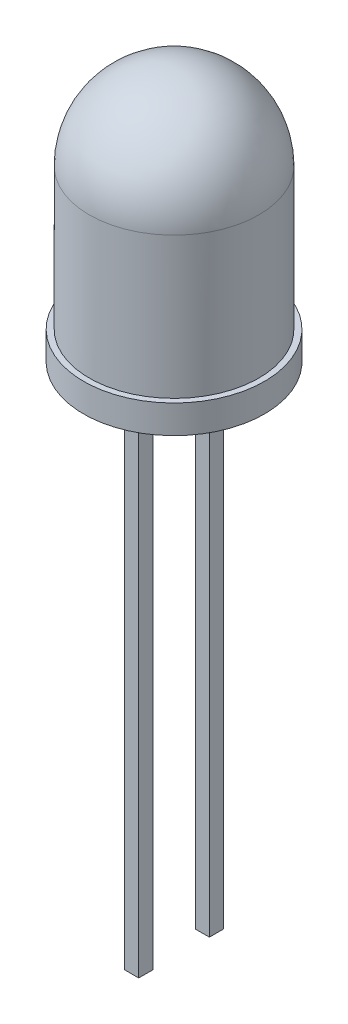
ISO-10303-21;
HEADER;
FILE_DESCRIPTION(('STEP AP214'),'2;1');
FILE_NAME('part.step','',(''),(''),'','','');
FILE_SCHEMA(('AUTOMOTIVE_DESIGN { 1 0 10303 214 1 1 1 1 }'));
ENDSEC;
DATA;
#1=APPLICATION_CONTEXT('core data for automotive mechanical design processes');
#2=APPLICATION_PROTOCOL_DEFINITION('international standard','automotive_design',2000,#1);
#3=PRODUCT_CONTEXT('',#1,'mechanical');
#4=PRODUCT('Part','Part','',(#3));
#5=PRODUCT_RELATED_PRODUCT_CATEGORY('part','',(#4));
#6=PRODUCT_DEFINITION_FORMATION('','',#4);
#7=PRODUCT_DEFINITION_CONTEXT('part definition',#1,'design');
#8=PRODUCT_DEFINITION('design','',#6,#7);
#9=PRODUCT_DEFINITION_SHAPE('','',#8);
#10=(LENGTH_UNIT() NAMED_UNIT(*) SI_UNIT(.MILLI.,.METRE.));
#11=(NAMED_UNIT(*) PLANE_ANGLE_UNIT() SI_UNIT($,.RADIAN.));
#12=(NAMED_UNIT(*) SI_UNIT($,.STERADIAN.) SOLID_ANGLE_UNIT());
#13=UNCERTAINTY_MEASURE_WITH_UNIT(LENGTH_MEASURE(1.E-05),#10,'distance_accuracy_value','');
#14=(GEOMETRIC_REPRESENTATION_CONTEXT(3) GLOBAL_UNCERTAINTY_ASSIGNED_CONTEXT((#13)) GLOBAL_UNIT_ASSIGNED_CONTEXT((#10,
#11,#12)) REPRESENTATION_CONTEXT('',''));
#15=CARTESIAN_POINT('',(0.,0.,0.));
#16=DIRECTION('',(0.,0.,1.));
#17=DIRECTION('',(1.,0.,0.));
#18=AXIS2_PLACEMENT_3D('',#15,#16,#17);
#19=CARTESIAN_POINT('',(0.,-1.,0.));
#20=DIRECTION('',(0.,-1.,0.));
#21=DIRECTION('',(0.,0.,-1.));
#22=AXIS2_PLACEMENT_3D('',#19,#20,#21);
#23=PLANE('',#22);
#24=DIRECTION('',(0.,0.,1.));
#25=VECTOR('',#24,1.);
#26=CARTESIAN_POINT('',(-0.25,-1.,-1.5));
#27=LINE('',#26,#25);
#28=CARTESIAN_POINT('',(-0.25,-1.,-1.5));
#29=VERTEX_POINT('',#28);
#30=CARTESIAN_POINT('',(-0.25,-1.,-1.));
#31=VERTEX_POINT('',#30);
#32=EDGE_CURVE('E108',#29,#31,#27,.T.);
#33=ORIENTED_EDGE('',*,*,#32,.T.);
#34=DIRECTION('',(1.,0.,0.));
#35=VECTOR('',#34,1.);
#36=CARTESIAN_POINT('',(-0.25,-1.,-1.));
#37=LINE('',#36,#35);
#38=CARTESIAN_POINT('',(0.25,-1.,-1.));
#39=VERTEX_POINT('',#38);
#40=EDGE_CURVE('E122',#31,#39,#37,.T.);
#41=ORIENTED_EDGE('',*,*,#40,.T.);
#42=DIRECTION('',(0.,0.,-1.));
#43=VECTOR('',#42,1.);
#44=CARTESIAN_POINT('',(0.25,-1.,-1.5));
#45=LINE('',#44,#43);
#46=CARTESIAN_POINT('',(0.25,-1.,-1.5));
#47=VERTEX_POINT('',#46);
#48=EDGE_CURVE('E58',#39,#47,#45,.T.);
#49=ORIENTED_EDGE('',*,*,#48,.T.);
#50=DIRECTION('',(-1.,0.,0.));
#51=VECTOR('',#50,1.);
#52=CARTESIAN_POINT('',(-0.25,-1.,-1.5));
#53=LINE('',#52,#51);
#54=EDGE_CURVE('E53',#47,#29,#53,.T.);
#55=ORIENTED_EDGE('',*,*,#54,.T.);
#56=EDGE_LOOP('',(#33,#41,#49,#55));
#57=FACE_BOUND('',#56,.T.);
#58=CARTESIAN_POINT('',(0.,-1.,0.));
#59=DIRECTION('',(0.,-1.,0.));
#60=DIRECTION('',(0.,0.,-1.));
#61=AXIS2_PLACEMENT_3D('',#58,#59,#60);
#62=CIRCLE('',#61,3.2);
#63=CARTESIAN_POINT('',(0.,-1.,-3.2));
#64=VERTEX_POINT('',#63);
#65=EDGE_CURVE('E169',#64,#64,#62,.T.);
#66=ORIENTED_EDGE('',*,*,#65,.T.);
#67=EDGE_LOOP('',(#66));
#68=FACE_BOUND('',#67,.T.);
#69=DIRECTION('',(1.,0.,0.));
#70=VECTOR('',#69,1.);
#71=CARTESIAN_POINT('',(-0.25,-1.,1.));
#72=LINE('',#71,#70);
#73=CARTESIAN_POINT('',(-0.25,-1.,1.));
#74=VERTEX_POINT('',#73);
#75=CARTESIAN_POINT('',(0.25,-1.,1.));
#76=VERTEX_POINT('',#75);
#77=EDGE_CURVE('E153',#74,#76,#72,.T.);
#78=ORIENTED_EDGE('',*,*,#77,.F.);
#79=DIRECTION('',(0.,0.,-1.));
#80=VECTOR('',#79,1.);
#81=CARTESIAN_POINT('',(-0.25,-1.,1.5));
#82=LINE('',#81,#80);
#83=CARTESIAN_POINT('',(-0.25,-1.,1.5));
#84=VERTEX_POINT('',#83);
#85=EDGE_CURVE('E111',#84,#74,#82,.T.);
#86=ORIENTED_EDGE('',*,*,#85,.F.);
#87=DIRECTION('',(-1.,0.,0.));
#88=VECTOR('',#87,1.);
#89=CARTESIAN_POINT('',(-0.25,-1.,1.5));
#90=LINE('',#89,#88);
#91=CARTESIAN_POINT('',(0.25,-1.,1.5));
#92=VERTEX_POINT('',#91);
#93=EDGE_CURVE('E144',#92,#84,#90,.T.);
#94=ORIENTED_EDGE('',*,*,#93,.F.);
#95=DIRECTION('',(0.,0.,1.));
#96=VECTOR('',#95,1.);
#97=CARTESIAN_POINT('',(0.25,-1.,1.5));
#98=LINE('',#97,#96);
#99=EDGE_CURVE('E155',#76,#92,#98,.T.);
#100=ORIENTED_EDGE('',*,*,#99,.F.);
#101=EDGE_LOOP('',(#78,#86,#94,#100));
#102=FACE_BOUND('',#101,.T.);
#103=ADVANCED_FACE('F38',(#57,#68,#102),#23,.T.);
#104=CARTESIAN_POINT('',(0.,0.,0.));
#105=DIRECTION('',(0.,-1.,0.));
#106=DIRECTION('',(0.,0.,-1.));
#107=AXIS2_PLACEMENT_3D('',#104,#105,#106);
#108=CYLINDRICAL_SURFACE('',#107,3.);
#109=CARTESIAN_POINT('',(0.,5.,0.));
#110=DIRECTION('',(0.,-1.,0.));
#111=DIRECTION('',(0.,0.,-1.));
#112=AXIS2_PLACEMENT_3D('',#109,#110,#111);
#113=CIRCLE('',#112,3.);
#114=CARTESIAN_POINT('',(0.,5.,-3.));
#115=VERTEX_POINT('',#114);
#116=EDGE_CURVE('E11',#115,#115,#113,.T.);
#117=ORIENTED_EDGE('',*,*,#116,.T.);
#118=EDGE_LOOP('',(#117));
#119=FACE_BOUND('',#118,.T.);
#120=CARTESIAN_POINT('',(0.,0.,0.));
#121=DIRECTION('',(0.,-1.,0.));
#122=DIRECTION('',(0.,0.,-1.));
#123=AXIS2_PLACEMENT_3D('',#120,#121,#122);
#124=CIRCLE('',#123,3.);
#125=CARTESIAN_POINT('',(0.,0.,-3.));
#126=VERTEX_POINT('',#125);
#127=EDGE_CURVE('E46',#126,#126,#124,.T.);
#128=ORIENTED_EDGE('',*,*,#127,.F.);
#129=EDGE_LOOP('',(#128));
#130=FACE_BOUND('',#129,.T.);
#131=ADVANCED_FACE('F179',(#119,#130),#108,.T.);
#132=CARTESIAN_POINT('',(0.,5.,0.));
#133=DIRECTION('',(0.,-1.,0.));
#134=DIRECTION('',(-1.,0.,0.));
#135=AXIS2_PLACEMENT_3D('',#132,#133,#134);
#136=SPHERICAL_SURFACE('',#135,3.);
#137=ORIENTED_EDGE('',*,*,#116,.F.);
#138=EDGE_LOOP('',(#137));
#139=FACE_BOUND('',#138,.T.);
#140=ADVANCED_FACE('F40',(#139),#136,.T.);
#141=CARTESIAN_POINT('',(0.,-1.,0.));
#142=DIRECTION('',(0.,1.,0.));
#143=DIRECTION('',(0.,0.,1.));
#144=AXIS2_PLACEMENT_3D('',#141,#142,#143);
#145=CYLINDRICAL_SURFACE('',#144,3.2);
#146=ORIENTED_EDGE('',*,*,#65,.F.);
#147=EDGE_LOOP('',(#146));
#148=FACE_BOUND('',#147,.T.);
#149=CARTESIAN_POINT('',(0.,0.,0.));
#150=DIRECTION('',(0.,-1.,0.));
#151=DIRECTION('',(0.,0.,-1.));
#152=AXIS2_PLACEMENT_3D('',#149,#150,#151);
#153=CIRCLE('',#152,3.2);
#154=CARTESIAN_POINT('',(0.,0.,-3.2));
#155=VERTEX_POINT('',#154);
#156=EDGE_CURVE('E168',#155,#155,#153,.T.);
#157=ORIENTED_EDGE('',*,*,#156,.T.);
#158=EDGE_LOOP('',(#157));
#159=FACE_BOUND('',#158,.T.);
#160=ADVANCED_FACE('F186',(#148,#159),#145,.T.);
#161=CARTESIAN_POINT('',(0.,0.,0.));
#162=DIRECTION('',(0.,-1.,0.));
#163=DIRECTION('',(0.,0.,-1.));
#164=AXIS2_PLACEMENT_3D('',#161,#162,#163);
#165=PLANE('',#164);
#166=ORIENTED_EDGE('',*,*,#127,.T.);
#167=EDGE_LOOP('',(#166));
#168=FACE_BOUND('',#167,.T.);
#169=ORIENTED_EDGE('',*,*,#156,.F.);
#170=EDGE_LOOP('',(#169));
#171=FACE_BOUND('',#170,.T.);
#172=ADVANCED_FACE('F176',(#168,#171),#165,.F.);
#173=CARTESIAN_POINT('',(-0.25,-19.,1.5));
#174=DIRECTION('',(1.,0.,0.));
#175=DIRECTION('',(0.,0.,-1.));
#176=AXIS2_PLACEMENT_3D('',#173,#174,#175);
#177=PLANE('',#176);
#178=ORIENTED_EDGE('',*,*,#85,.T.);
#179=DIRECTION('',(0.,1.,0.));
#180=VECTOR('',#179,1.);
#181=CARTESIAN_POINT('',(-0.25,-19.,1.));
#182=LINE('',#181,#180);
#183=CARTESIAN_POINT('',(-0.25,-19.,1.));
#184=VERTEX_POINT('',#183);
#185=EDGE_CURVE('E166',#184,#74,#182,.T.);
#186=ORIENTED_EDGE('',*,*,#185,.F.);
#187=DIRECTION('',(0.,0.,-1.));
#188=VECTOR('',#187,1.);
#189=CARTESIAN_POINT('',(-0.25,-19.,1.5));
#190=LINE('',#189,#188);
#191=CARTESIAN_POINT('',(-0.25,-19.,1.5));
#192=VERTEX_POINT('',#191);
#193=EDGE_CURVE('E140',#192,#184,#190,.T.);
#194=ORIENTED_EDGE('',*,*,#193,.F.);
#195=DIRECTION('',(0.,1.,0.));
#196=VECTOR('',#195,1.);
#197=CARTESIAN_POINT('',(-0.25,-19.,1.5));
#198=LINE('',#197,#196);
#199=EDGE_CURVE('E150',#192,#84,#198,.T.);
#200=ORIENTED_EDGE('',*,*,#199,.T.);
#201=EDGE_LOOP('',(#178,#186,#194,#200));
#202=FACE_BOUND('',#201,.T.);
#203=ADVANCED_FACE('F194',(#202),#177,.F.);
#204=CARTESIAN_POINT('',(-0.25,-19.,1.));
#205=DIRECTION('',(0.,0.,1.));
#206=DIRECTION('',(1.,0.,0.));
#207=AXIS2_PLACEMENT_3D('',#204,#205,#206);
#208=PLANE('',#207);
#209=ORIENTED_EDGE('',*,*,#77,.T.);
#210=DIRECTION('',(0.,1.,0.));
#211=VECTOR('',#210,1.);
#212=CARTESIAN_POINT('',(0.25,-19.,1.));
#213=LINE('',#212,#211);
#214=CARTESIAN_POINT('',(0.25,-19.,1.));
#215=VERTEX_POINT('',#214);
#216=EDGE_CURVE('E163',#215,#76,#213,.T.);
#217=ORIENTED_EDGE('',*,*,#216,.F.);
#218=DIRECTION('',(1.,0.,0.));
#219=VECTOR('',#218,1.);
#220=CARTESIAN_POINT('',(-0.25,-19.,1.));
#221=LINE('',#220,#219);
#222=EDGE_CURVE('E143',#184,#215,#221,.T.);
#223=ORIENTED_EDGE('',*,*,#222,.F.);
#224=ORIENTED_EDGE('',*,*,#185,.T.);
#225=EDGE_LOOP('',(#209,#217,#223,#224));
#226=FACE_BOUND('',#225,.T.);
#227=ADVANCED_FACE('F198',(#226),#208,.F.);
#228=CARTESIAN_POINT('',(0.25,-19.,1.5));
#229=DIRECTION('',(-1.,0.,0.));
#230=DIRECTION('',(0.,0.,1.));
#231=AXIS2_PLACEMENT_3D('',#228,#229,#230);
#232=PLANE('',#231);
#233=ORIENTED_EDGE('',*,*,#99,.T.);
#234=DIRECTION('',(0.,1.,0.));
#235=VECTOR('',#234,1.);
#236=CARTESIAN_POINT('',(0.25,-19.,1.5));
#237=LINE('',#236,#235);
#238=CARTESIAN_POINT('',(0.25,-19.,1.5));
#239=VERTEX_POINT('',#238);
#240=EDGE_CURVE('E161',#239,#92,#237,.T.);
#241=ORIENTED_EDGE('',*,*,#240,.F.);
#242=DIRECTION('',(0.,0.,1.));
#243=VECTOR('',#242,1.);
#244=CARTESIAN_POINT('',(0.25,-19.,1.5));
#245=LINE('',#244,#243);
#246=EDGE_CURVE('E146',#215,#239,#245,.T.);
#247=ORIENTED_EDGE('',*,*,#246,.F.);
#248=ORIENTED_EDGE('',*,*,#216,.T.);
#249=EDGE_LOOP('',(#233,#241,#247,#248));
#250=FACE_BOUND('',#249,.T.);
#251=ADVANCED_FACE('F202',(#250),#232,.F.);
#252=CARTESIAN_POINT('',(-0.25,-19.,1.5));
#253=DIRECTION('',(0.,0.,-1.));
#254=DIRECTION('',(-1.,0.,0.));
#255=AXIS2_PLACEMENT_3D('',#252,#253,#254);
#256=PLANE('',#255);
#257=ORIENTED_EDGE('',*,*,#93,.T.);
#258=ORIENTED_EDGE('',*,*,#199,.F.);
#259=DIRECTION('',(-1.,0.,0.));
#260=VECTOR('',#259,1.);
#261=CARTESIAN_POINT('',(-0.25,-19.,1.5));
#262=LINE('',#261,#260);
#263=EDGE_CURVE('E148',#239,#192,#262,.T.);
#264=ORIENTED_EDGE('',*,*,#263,.F.);
#265=ORIENTED_EDGE('',*,*,#240,.T.);
#266=EDGE_LOOP('',(#257,#258,#264,#265));
#267=FACE_BOUND('',#266,.T.);
#268=ADVANCED_FACE('F206',(#267),#256,.F.);
#269=CARTESIAN_POINT('',(0.,-19.,0.));
#270=DIRECTION('',(0.,-1.,0.));
#271=DIRECTION('',(0.,0.,-1.));
#272=AXIS2_PLACEMENT_3D('',#269,#270,#271);
#273=PLANE('',#272);
#274=ORIENTED_EDGE('',*,*,#193,.T.);
#275=ORIENTED_EDGE('',*,*,#222,.T.);
#276=ORIENTED_EDGE('',*,*,#246,.T.);
#277=ORIENTED_EDGE('',*,*,#263,.T.);
#278=EDGE_LOOP('',(#274,#275,#276,#277));
#279=FACE_BOUND('',#278,.T.);
#280=ADVANCED_FACE('F210',(#279),#273,.T.);
#281=CARTESIAN_POINT('',(-0.25,-19.,-1.5));
#282=DIRECTION('',(-1.,0.,0.));
#283=DIRECTION('',(0.,0.,1.));
#284=AXIS2_PLACEMENT_3D('',#281,#282,#283);
#285=PLANE('',#284);
#286=ORIENTED_EDGE('',*,*,#32,.F.);
#287=DIRECTION('',(0.,1.,0.));
#288=VECTOR('',#287,1.);
#289=CARTESIAN_POINT('',(-0.25,-19.,-1.5));
#290=LINE('',#289,#288);
#291=CARTESIAN_POINT('',(-0.25,-19.,-1.5));
#292=VERTEX_POINT('',#291);
#293=EDGE_CURVE('E102',#292,#29,#290,.T.);
#294=ORIENTED_EDGE('',*,*,#293,.F.);
#295=DIRECTION('',(0.,0.,1.));
#296=VECTOR('',#295,1.);
#297=CARTESIAN_POINT('',(-0.25,-19.,-1.5));
#298=LINE('',#297,#296);
#299=CARTESIAN_POINT('',(-0.25,-19.,-1.));
#300=VERTEX_POINT('',#299);
#301=EDGE_CURVE('E106',#292,#300,#298,.T.);
#302=ORIENTED_EDGE('',*,*,#301,.T.);
#303=DIRECTION('',(0.,1.,0.));
#304=VECTOR('',#303,1.);
#305=CARTESIAN_POINT('',(-0.25,-19.,-1.));
#306=LINE('',#305,#304);
#307=EDGE_CURVE('E130',#300,#31,#306,.T.);
#308=ORIENTED_EDGE('',*,*,#307,.T.);
#309=EDGE_LOOP('',(#286,#294,#302,#308));
#310=FACE_BOUND('',#309,.T.);
#311=ADVANCED_FACE('F104',(#310),#285,.T.);
#312=CARTESIAN_POINT('',(-0.25,-19.,-1.5));
#313=DIRECTION('',(0.,0.,-1.));
#314=DIRECTION('',(-1.,0.,0.));
#315=AXIS2_PLACEMENT_3D('',#312,#313,#314);
#316=PLANE('',#315);
#317=ORIENTED_EDGE('',*,*,#54,.F.);
#318=DIRECTION('',(0.,1.,0.));
#319=VECTOR('',#318,1.);
#320=CARTESIAN_POINT('',(0.25,-19.,-1.5));
#321=LINE('',#320,#319);
#322=CARTESIAN_POINT('',(0.25,-19.,-1.5));
#323=VERTEX_POINT('',#322);
#324=EDGE_CURVE('E112',#323,#47,#321,.T.);
#325=ORIENTED_EDGE('',*,*,#324,.F.);
#326=DIRECTION('',(-1.,0.,0.));
#327=VECTOR('',#326,1.);
#328=CARTESIAN_POINT('',(-0.25,-19.,-1.5));
#329=LINE('',#328,#327);
#330=EDGE_CURVE('E118',#323,#292,#329,.T.);
#331=ORIENTED_EDGE('',*,*,#330,.T.);
#332=ORIENTED_EDGE('',*,*,#293,.T.);
#333=EDGE_LOOP('',(#317,#325,#331,#332));
#334=FACE_BOUND('',#333,.T.);
#335=ADVANCED_FACE('F124',(#334),#316,.T.);
#336=CARTESIAN_POINT('',(0.25,-19.,-1.5));
#337=DIRECTION('',(1.,0.,0.));
#338=DIRECTION('',(0.,0.,-1.));
#339=AXIS2_PLACEMENT_3D('',#336,#337,#338);
#340=PLANE('',#339);
#341=ORIENTED_EDGE('',*,*,#48,.F.);
#342=DIRECTION('',(0.,1.,0.));
#343=VECTOR('',#342,1.);
#344=CARTESIAN_POINT('',(0.25,-19.,-1.));
#345=LINE('',#344,#343);
#346=CARTESIAN_POINT('',(0.25,-19.,-1.));
#347=VERTEX_POINT('',#346);
#348=EDGE_CURVE('E136',#347,#39,#345,.T.);
#349=ORIENTED_EDGE('',*,*,#348,.F.);
#350=DIRECTION('',(0.,0.,-1.));
#351=VECTOR('',#350,1.);
#352=CARTESIAN_POINT('',(0.25,-19.,-1.5));
#353=LINE('',#352,#351);
#354=EDGE_CURVE('E125',#347,#323,#353,.T.);
#355=ORIENTED_EDGE('',*,*,#354,.T.);
#356=ORIENTED_EDGE('',*,*,#324,.T.);
#357=EDGE_LOOP('',(#341,#349,#355,#356));
#358=FACE_BOUND('',#357,.T.);
#359=ADVANCED_FACE('F219',(#358),#340,.T.);
#360=CARTESIAN_POINT('',(-0.25,-19.,-1.));
#361=DIRECTION('',(0.,0.,1.));
#362=DIRECTION('',(1.,0.,0.));
#363=AXIS2_PLACEMENT_3D('',#360,#361,#362);
#364=PLANE('',#363);
#365=ORIENTED_EDGE('',*,*,#40,.F.);
#366=ORIENTED_EDGE('',*,*,#307,.F.);
#367=DIRECTION('',(1.,0.,0.));
#368=VECTOR('',#367,1.);
#369=CARTESIAN_POINT('',(-0.25,-19.,-1.));
#370=LINE('',#369,#368);
#371=EDGE_CURVE('E121',#300,#347,#370,.T.);
#372=ORIENTED_EDGE('',*,*,#371,.T.);
#373=ORIENTED_EDGE('',*,*,#348,.T.);
#374=EDGE_LOOP('',(#365,#366,#372,#373));
#375=FACE_BOUND('',#374,.T.);
#376=ADVANCED_FACE('F222',(#375),#364,.T.);
#377=CARTESIAN_POINT('',(0.,-19.,0.));
#378=DIRECTION('',(0.,-1.,0.));
#379=DIRECTION('',(0.,0.,1.));
#380=AXIS2_PLACEMENT_3D('',#377,#378,#379);
#381=PLANE('',#380);
#382=ORIENTED_EDGE('',*,*,#301,.F.);
#383=ORIENTED_EDGE('',*,*,#330,.F.);
#384=ORIENTED_EDGE('',*,*,#354,.F.);
#385=ORIENTED_EDGE('',*,*,#371,.F.);
#386=EDGE_LOOP('',(#382,#383,#384,#385));
#387=FACE_BOUND('',#386,.T.);
#388=ADVANCED_FACE('F116',(#387),#381,.T.);
#389=CLOSED_SHELL('',(#103,#131,#140,#160,#172,#203,#227,#251,#268,#280,#311,#335,#359,#376,#388));
#390=MANIFOLD_SOLID_BREP('B2',#389);
#391=ADVANCED_BREP_SHAPE_REPRESENTATION('',(#18,#390),#14);
#392=SHAPE_DEFINITION_REPRESENTATION(#9,#391);
ENDSEC;
END-ISO-10303-21;
